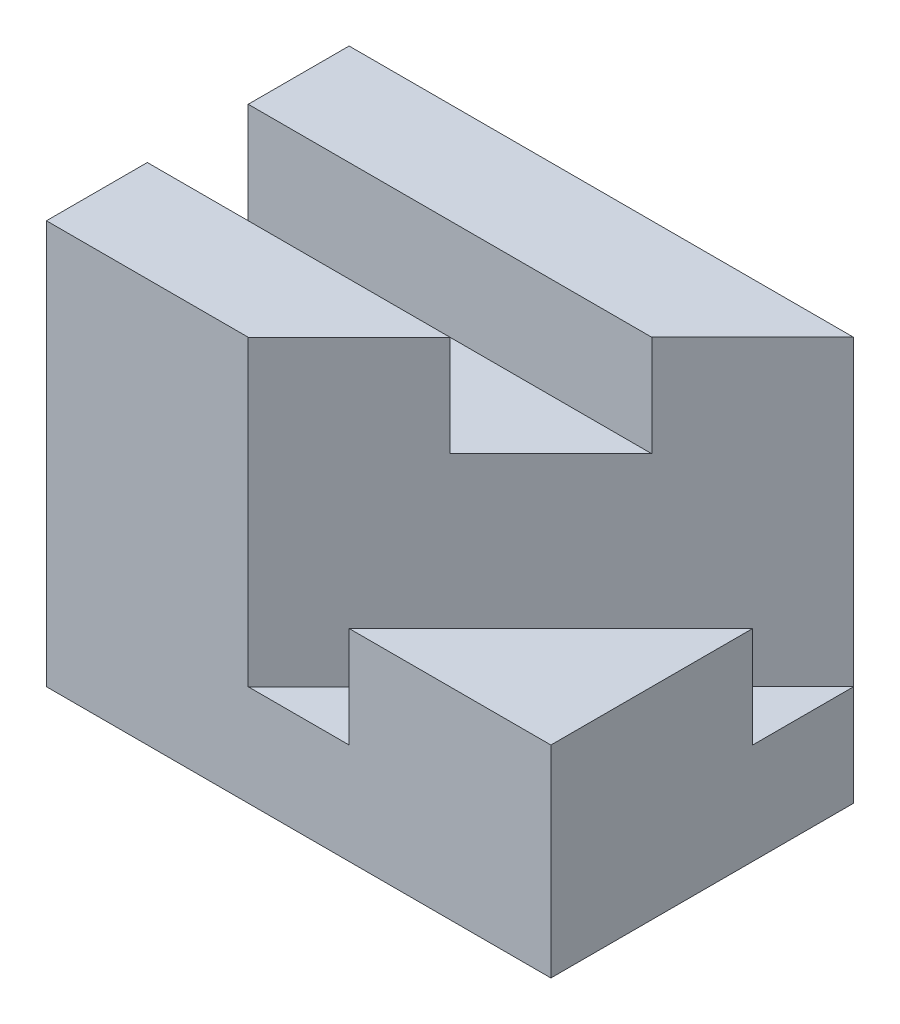
ISO-10303-21;
HEADER;
FILE_DESCRIPTION(('STEP AP214'),'2;1');
FILE_NAME('part.step','',(''),(''),'','','');
FILE_SCHEMA(('AUTOMOTIVE_DESIGN { 1 0 10303 214 1 1 1 1 }'));
ENDSEC;
DATA;
#1=APPLICATION_CONTEXT('core data for automotive mechanical design processes');
#2=APPLICATION_PROTOCOL_DEFINITION('international standard','automotive_design',2000,#1);
#3=PRODUCT_CONTEXT('',#1,'mechanical');
#4=PRODUCT('Part','Part','',(#3));
#5=PRODUCT_RELATED_PRODUCT_CATEGORY('part','',(#4));
#6=PRODUCT_DEFINITION_FORMATION('','',#4);
#7=PRODUCT_DEFINITION_CONTEXT('part definition',#1,'design');
#8=PRODUCT_DEFINITION('design','',#6,#7);
#9=PRODUCT_DEFINITION_SHAPE('','',#8);
#10=(LENGTH_UNIT() NAMED_UNIT(*) SI_UNIT(.MILLI.,.METRE.));
#11=(NAMED_UNIT(*) PLANE_ANGLE_UNIT() SI_UNIT($,.RADIAN.));
#12=(NAMED_UNIT(*) SI_UNIT($,.STERADIAN.) SOLID_ANGLE_UNIT());
#13=UNCERTAINTY_MEASURE_WITH_UNIT(LENGTH_MEASURE(1.E-05),#10,'distance_accuracy_value','');
#14=(GEOMETRIC_REPRESENTATION_CONTEXT(3) GLOBAL_UNCERTAINTY_ASSIGNED_CONTEXT((#13)) GLOBAL_UNIT_ASSIGNED_CONTEXT((#10,
#11,#12)) REPRESENTATION_CONTEXT('',''));
#15=CARTESIAN_POINT('',(0.,0.,0.));
#16=DIRECTION('',(0.,0.,1.));
#17=DIRECTION('',(1.,0.,0.));
#18=AXIS2_PLACEMENT_3D('',#15,#16,#17);
#19=CARTESIAN_POINT('',(0.,4.,0.));
#20=DIRECTION('',(0.,-1.,0.));
#21=DIRECTION('',(0.,0.,-1.));
#22=AXIS2_PLACEMENT_3D('',#19,#20,#21);
#23=PLANE('',#22);
#24=DIRECTION('',(0.707106781186547,0.,-0.707106781186548));
#25=VECTOR('',#24,1.);
#26=CARTESIAN_POINT('',(5.,4.,-3.));
#27=LINE('',#26,#25);
#28=CARTESIAN_POINT('',(2.,4.,0.));
#29=VERTEX_POINT('',#28);
#30=CARTESIAN_POINT('',(3.,4.,-1.));
#31=VERTEX_POINT('',#30);
#32=EDGE_CURVE('E200',#29,#31,#27,.T.);
#33=ORIENTED_EDGE('',*,*,#32,.T.);
#34=DIRECTION('',(-1.,0.,0.));
#35=VECTOR('',#34,1.);
#36=CARTESIAN_POINT('',(0.,4.,-1.));
#37=LINE('',#36,#35);
#38=CARTESIAN_POINT('',(0.,4.,-1.));
#39=VERTEX_POINT('',#38);
#40=EDGE_CURVE('E43',#31,#39,#37,.T.);
#41=ORIENTED_EDGE('',*,*,#40,.T.);
#42=DIRECTION('',(0.,0.,1.));
#43=VECTOR('',#42,1.);
#44=CARTESIAN_POINT('',(0.,4.,0.));
#45=LINE('',#44,#43);
#46=CARTESIAN_POINT('',(0.,4.,0.));
#47=VERTEX_POINT('',#46);
#48=EDGE_CURVE('E144',#39,#47,#45,.T.);
#49=ORIENTED_EDGE('',*,*,#48,.T.);
#50=DIRECTION('',(1.,0.,0.));
#51=VECTOR('',#50,1.);
#52=CARTESIAN_POINT('',(2.,4.,0.));
#53=LINE('',#52,#51);
#54=EDGE_CURVE('E152',#47,#29,#53,.T.);
#55=ORIENTED_EDGE('',*,*,#54,.T.);
#56=EDGE_LOOP('',(#33,#41,#49,#55));
#57=FACE_BOUND('',#56,.T.);
#58=ADVANCED_FACE('F35',(#57),#23,.F.);
#59=CARTESIAN_POINT('',(0.,1.,0.));
#60=DIRECTION('',(0.,1.,0.));
#61=DIRECTION('',(0.,0.,1.));
#62=AXIS2_PLACEMENT_3D('',#59,#60,#61);
#63=PLANE('',#62);
#64=DIRECTION('',(0.,0.,-1.));
#65=VECTOR('',#64,1.);
#66=CARTESIAN_POINT('',(5.,1.,0.));
#67=LINE('',#66,#65);
#68=CARTESIAN_POINT('',(5.,1.,-2.));
#69=VERTEX_POINT('',#68);
#70=CARTESIAN_POINT('',(5.,1.,-3.));
#71=VERTEX_POINT('',#70);
#72=EDGE_CURVE('E176',#69,#71,#67,.T.);
#73=ORIENTED_EDGE('',*,*,#72,.T.);
#74=DIRECTION('',(0.707106781186547,0.,-0.707106781186548));
#75=VECTOR('',#74,1.);
#76=CARTESIAN_POINT('',(5.,1.,-3.));
#77=LINE('',#76,#75);
#78=CARTESIAN_POINT('',(2.,1.,0.));
#79=VERTEX_POINT('',#78);
#80=EDGE_CURVE('E58',#79,#71,#77,.T.);
#81=ORIENTED_EDGE('',*,*,#80,.F.);
#82=DIRECTION('',(1.,0.,0.));
#83=VECTOR('',#82,1.);
#84=CARTESIAN_POINT('',(0.,1.,0.));
#85=LINE('',#84,#83);
#86=CARTESIAN_POINT('',(3.,1.,0.));
#87=VERTEX_POINT('',#86);
#88=EDGE_CURVE('E174',#79,#87,#85,.T.);
#89=ORIENTED_EDGE('',*,*,#88,.T.);
#90=DIRECTION('',(-0.707106781186547,0.,0.707106781186548));
#91=VECTOR('',#90,1.);
#92=CARTESIAN_POINT('',(3.,1.,0.));
#93=LINE('',#92,#91);
#94=EDGE_CURVE('E157',#69,#87,#93,.T.);
#95=ORIENTED_EDGE('',*,*,#94,.F.);
#96=EDGE_LOOP('',(#73,#81,#89,#95));
#97=FACE_BOUND('',#96,.T.);
#98=ADVANCED_FACE('F244',(#97),#63,.T.);
#99=CARTESIAN_POINT('',(0.,1.,-3.));
#100=DIRECTION('',(1.,0.,0.));
#101=DIRECTION('',(0.,0.,-1.));
#102=AXIS2_PLACEMENT_3D('',#99,#100,#101);
#103=PLANE('',#102);
#104=ORIENTED_EDGE('',*,*,#48,.F.);
#105=DIRECTION('',(0.,1.,0.));
#106=VECTOR('',#105,1.);
#107=CARTESIAN_POINT('',(0.,3.,-1.));
#108=LINE('',#107,#106);
#109=CARTESIAN_POINT('',(0.,3.,-1.));
#110=VERTEX_POINT('',#109);
#111=EDGE_CURVE('E203',#110,#39,#108,.T.);
#112=ORIENTED_EDGE('',*,*,#111,.F.);
#113=DIRECTION('',(0.,0.,1.));
#114=VECTOR('',#113,1.);
#115=CARTESIAN_POINT('',(0.,3.,-2.));
#116=LINE('',#115,#114);
#117=CARTESIAN_POINT('',(0.,3.,-2.));
#118=VERTEX_POINT('',#117);
#119=EDGE_CURVE('E137',#118,#110,#116,.T.);
#120=ORIENTED_EDGE('',*,*,#119,.F.);
#121=DIRECTION('',(0.,-1.,0.));
#122=VECTOR('',#121,1.);
#123=CARTESIAN_POINT('',(0.,4.,-2.));
#124=LINE('',#123,#122);
#125=CARTESIAN_POINT('',(0.,4.,-2.));
#126=VERTEX_POINT('',#125);
#127=EDGE_CURVE('E123',#126,#118,#124,.T.);
#128=ORIENTED_EDGE('',*,*,#127,.F.);
#129=CARTESIAN_POINT('',(0.,4.,-3.));
#130=VERTEX_POINT('',#129);
#131=EDGE_CURVE('E134',#130,#126,#45,.T.);
#132=ORIENTED_EDGE('',*,*,#131,.F.);
#133=DIRECTION('',(0.,-1.,0.));
#134=VECTOR('',#133,1.);
#135=CARTESIAN_POINT('',(0.,1.,-3.));
#136=LINE('',#135,#134);
#137=CARTESIAN_POINT('',(0.,0.,-3.));
#138=VERTEX_POINT('',#137);
#139=EDGE_CURVE('E179',#130,#138,#136,.T.);
#140=ORIENTED_EDGE('',*,*,#139,.T.);
#141=DIRECTION('',(0.,0.,1.));
#142=VECTOR('',#141,1.);
#143=CARTESIAN_POINT('',(0.,0.,-3.));
#144=LINE('',#143,#142);
#145=CARTESIAN_POINT('',(0.,0.,0.));
#146=VERTEX_POINT('',#145);
#147=EDGE_CURVE('E173',#138,#146,#144,.T.);
#148=ORIENTED_EDGE('',*,*,#147,.T.);
#149=DIRECTION('',(0.,-1.,0.));
#150=VECTOR('',#149,1.);
#151=CARTESIAN_POINT('',(0.,1.,0.));
#152=LINE('',#151,#150);
#153=EDGE_CURVE('E128',#47,#146,#152,.T.);
#154=ORIENTED_EDGE('',*,*,#153,.F.);
#155=EDGE_LOOP('',(#104,#112,#120,#128,#132,#140,#148,#154));
#156=FACE_BOUND('',#155,.T.);
#157=ADVANCED_FACE('F37',(#156),#103,.F.);
#158=CARTESIAN_POINT('',(0.,1.,0.));
#159=DIRECTION('',(0.,0.,-1.));
#160=DIRECTION('',(-1.,0.,0.));
#161=AXIS2_PLACEMENT_3D('',#158,#159,#160);
#162=PLANE('',#161);
#163=DIRECTION('',(1.,0.,0.));
#164=VECTOR('',#163,1.);
#165=CARTESIAN_POINT('',(0.,0.,0.));
#166=LINE('',#165,#164);
#167=CARTESIAN_POINT('',(5.,0.,0.));
#168=VERTEX_POINT('',#167);
#169=EDGE_CURVE('E182',#146,#168,#166,.T.);
#170=ORIENTED_EDGE('',*,*,#169,.T.);
#171=DIRECTION('',(0.,-1.,0.));
#172=VECTOR('',#171,1.);
#173=CARTESIAN_POINT('',(5.,1.,0.));
#174=LINE('',#173,#172);
#175=CARTESIAN_POINT('',(5.,2.,0.));
#176=VERTEX_POINT('',#175);
#177=EDGE_CURVE('E191',#176,#168,#174,.T.);
#178=ORIENTED_EDGE('',*,*,#177,.F.);
#179=DIRECTION('',(1.,0.,0.));
#180=VECTOR('',#179,1.);
#181=CARTESIAN_POINT('',(5.,2.,0.));
#182=LINE('',#181,#180);
#183=CARTESIAN_POINT('',(3.,2.,0.));
#184=VERTEX_POINT('',#183);
#185=EDGE_CURVE('E158',#184,#176,#182,.T.);
#186=ORIENTED_EDGE('',*,*,#185,.F.);
#187=DIRECTION('',(0.,-1.,0.));
#188=VECTOR('',#187,1.);
#189=CARTESIAN_POINT('',(3.,2.,0.));
#190=LINE('',#189,#188);
#191=EDGE_CURVE('E165',#184,#87,#190,.T.);
#192=ORIENTED_EDGE('',*,*,#191,.T.);
#193=ORIENTED_EDGE('',*,*,#88,.F.);
#194=DIRECTION('',(0.,-1.,0.));
#195=VECTOR('',#194,1.);
#196=CARTESIAN_POINT('',(2.,4.,0.));
#197=LINE('',#196,#195);
#198=EDGE_CURVE('E147',#29,#79,#197,.T.);
#199=ORIENTED_EDGE('',*,*,#198,.F.);
#200=ORIENTED_EDGE('',*,*,#54,.F.);
#201=ORIENTED_EDGE('',*,*,#153,.T.);
#202=EDGE_LOOP('',(#170,#178,#186,#192,#193,#199,#200,#201));
#203=FACE_BOUND('',#202,.T.);
#204=ADVANCED_FACE('F208',(#203),#162,.F.);
#205=CARTESIAN_POINT('',(5.,1.,0.));
#206=DIRECTION('',(-1.,0.,0.));
#207=DIRECTION('',(0.,0.,1.));
#208=AXIS2_PLACEMENT_3D('',#205,#206,#207);
#209=PLANE('',#208);
#210=DIRECTION('',(0.,0.,-1.));
#211=VECTOR('',#210,1.);
#212=CARTESIAN_POINT('',(5.,0.,0.));
#213=LINE('',#212,#211);
#214=CARTESIAN_POINT('',(5.,0.,-3.));
#215=VERTEX_POINT('',#214);
#216=EDGE_CURVE('E184',#168,#215,#213,.T.);
#217=ORIENTED_EDGE('',*,*,#216,.T.);
#218=DIRECTION('',(0.,-1.,0.));
#219=VECTOR('',#218,1.);
#220=CARTESIAN_POINT('',(5.,1.,-3.));
#221=LINE('',#220,#219);
#222=EDGE_CURVE('E188',#71,#215,#221,.T.);
#223=ORIENTED_EDGE('',*,*,#222,.F.);
#224=ORIENTED_EDGE('',*,*,#72,.F.);
#225=DIRECTION('',(0.,-1.,0.));
#226=VECTOR('',#225,1.);
#227=CARTESIAN_POINT('',(5.,2.,-2.));
#228=LINE('',#227,#226);
#229=CARTESIAN_POINT('',(5.,2.,-2.));
#230=VERTEX_POINT('',#229);
#231=EDGE_CURVE('E170',#230,#69,#228,.T.);
#232=ORIENTED_EDGE('',*,*,#231,.F.);
#233=DIRECTION('',(0.,0.,-1.));
#234=VECTOR('',#233,1.);
#235=CARTESIAN_POINT('',(5.,2.,0.));
#236=LINE('',#235,#234);
#237=EDGE_CURVE('E161',#176,#230,#236,.T.);
#238=ORIENTED_EDGE('',*,*,#237,.F.);
#239=ORIENTED_EDGE('',*,*,#177,.T.);
#240=EDGE_LOOP('',(#217,#223,#224,#232,#238,#239));
#241=FACE_BOUND('',#240,.T.);
#242=ADVANCED_FACE('F234',(#241),#209,.F.);
#243=CARTESIAN_POINT('',(5.,1.,-3.));
#244=DIRECTION('',(0.,0.,1.));
#245=DIRECTION('',(1.,0.,0.));
#246=AXIS2_PLACEMENT_3D('',#243,#244,#245);
#247=PLANE('',#246);
#248=DIRECTION('',(-1.,0.,0.));
#249=VECTOR('',#248,1.);
#250=CARTESIAN_POINT('',(5.,0.,-3.));
#251=LINE('',#250,#249);
#252=EDGE_CURVE('E177',#215,#138,#251,.T.);
#253=ORIENTED_EDGE('',*,*,#252,.T.);
#254=ORIENTED_EDGE('',*,*,#139,.F.);
#255=DIRECTION('',(-1.,0.,0.));
#256=VECTOR('',#255,1.);
#257=CARTESIAN_POINT('',(0.,4.,-3.));
#258=LINE('',#257,#256);
#259=CARTESIAN_POINT('',(5.,4.,-3.));
#260=VERTEX_POINT('',#259);
#261=EDGE_CURVE('E142',#260,#130,#258,.T.);
#262=ORIENTED_EDGE('',*,*,#261,.F.);
#263=DIRECTION('',(0.,-1.,0.));
#264=VECTOR('',#263,1.);
#265=CARTESIAN_POINT('',(5.,4.,-3.));
#266=LINE('',#265,#264);
#267=EDGE_CURVE('E143',#260,#71,#266,.T.);
#268=ORIENTED_EDGE('',*,*,#267,.T.);
#269=ORIENTED_EDGE('',*,*,#222,.T.);
#270=EDGE_LOOP('',(#253,#254,#262,#268,#269));
#271=FACE_BOUND('',#270,.T.);
#272=ADVANCED_FACE('F226',(#271),#247,.F.);
#273=CARTESIAN_POINT('',(0.,0.,0.));
#274=DIRECTION('',(0.,1.,0.));
#275=DIRECTION('',(0.,0.,1.));
#276=AXIS2_PLACEMENT_3D('',#273,#274,#275);
#277=PLANE('',#276);
#278=ORIENTED_EDGE('',*,*,#147,.F.);
#279=ORIENTED_EDGE('',*,*,#252,.F.);
#280=ORIENTED_EDGE('',*,*,#216,.F.);
#281=ORIENTED_EDGE('',*,*,#169,.F.);
#282=EDGE_LOOP('',(#278,#279,#280,#281));
#283=FACE_BOUND('',#282,.T.);
#284=ADVANCED_FACE('F229',(#283),#277,.F.);
#285=CARTESIAN_POINT('',(3.,2.,0.));
#286=DIRECTION('',(0.707106781186548,0.,0.707106781186547));
#287=DIRECTION('',(0.707106781186547,0.,-0.707106781186548));
#288=AXIS2_PLACEMENT_3D('',#285,#286,#287);
#289=PLANE('',#288);
#290=ORIENTED_EDGE('',*,*,#94,.T.);
#291=ORIENTED_EDGE('',*,*,#191,.F.);
#292=DIRECTION('',(-0.707106781186547,0.,0.707106781186548));
#293=VECTOR('',#292,1.);
#294=CARTESIAN_POINT('',(3.,2.,0.));
#295=LINE('',#294,#293);
#296=EDGE_CURVE('E163',#230,#184,#295,.T.);
#297=ORIENTED_EDGE('',*,*,#296,.F.);
#298=ORIENTED_EDGE('',*,*,#231,.T.);
#299=EDGE_LOOP('',(#290,#291,#297,#298));
#300=FACE_BOUND('',#299,.T.);
#301=ADVANCED_FACE('F243',(#300),#289,.F.);
#302=CARTESIAN_POINT('',(0.,2.,0.));
#303=DIRECTION('',(0.,-1.,0.));
#304=DIRECTION('',(0.,0.,-1.));
#305=AXIS2_PLACEMENT_3D('',#302,#303,#304);
#306=PLANE('',#305);
#307=ORIENTED_EDGE('',*,*,#185,.T.);
#308=ORIENTED_EDGE('',*,*,#237,.T.);
#309=ORIENTED_EDGE('',*,*,#296,.T.);
#310=EDGE_LOOP('',(#307,#308,#309));
#311=FACE_BOUND('',#310,.T.);
#312=ADVANCED_FACE('F240',(#311),#306,.F.);
#313=CARTESIAN_POINT('',(5.,4.,-3.));
#314=DIRECTION('',(-0.707106781186548,0.,-0.707106781186547));
#315=DIRECTION('',(-0.707106781186547,0.,0.707106781186548));
#316=AXIS2_PLACEMENT_3D('',#313,#314,#315);
#317=PLANE('',#316);
#318=DIRECTION('',(-0.707106781186547,0.,0.707106781186548));
#319=VECTOR('',#318,1.);
#320=CARTESIAN_POINT('',(5.,3.,-3.));
#321=LINE('',#320,#319);
#322=CARTESIAN_POINT('',(4.,3.,-2.));
#323=VERTEX_POINT('',#322);
#324=CARTESIAN_POINT('',(3.,3.,-1.));
#325=VERTEX_POINT('',#324);
#326=EDGE_CURVE('E11',#323,#325,#321,.T.);
#327=ORIENTED_EDGE('',*,*,#326,.T.);
#328=DIRECTION('',(0.,1.,0.));
#329=VECTOR('',#328,1.);
#330=CARTESIAN_POINT('',(3.,4.,-1.));
#331=LINE('',#330,#329);
#332=EDGE_CURVE('E153',#325,#31,#331,.T.);
#333=ORIENTED_EDGE('',*,*,#332,.T.);
#334=ORIENTED_EDGE('',*,*,#32,.F.);
#335=ORIENTED_EDGE('',*,*,#198,.T.);
#336=ORIENTED_EDGE('',*,*,#80,.T.);
#337=ORIENTED_EDGE('',*,*,#267,.F.);
#338=CARTESIAN_POINT('',(4.,4.,-2.));
#339=VERTEX_POINT('',#338);
#340=EDGE_CURVE('E209',#339,#260,#27,.T.);
#341=ORIENTED_EDGE('',*,*,#340,.F.);
#342=DIRECTION('',(0.,-1.,0.));
#343=VECTOR('',#342,1.);
#344=CARTESIAN_POINT('',(4.,4.,-2.));
#345=LINE('',#344,#343);
#346=EDGE_CURVE('E50',#339,#323,#345,.T.);
#347=ORIENTED_EDGE('',*,*,#346,.T.);
#348=EDGE_LOOP('',(#327,#333,#334,#335,#336,#337,#341,#347));
#349=FACE_BOUND('',#348,.T.);
#350=ADVANCED_FACE('F223',(#349),#317,.F.);
#351=ORIENTED_EDGE('',*,*,#131,.T.);
#352=DIRECTION('',(1.,0.,0.));
#353=VECTOR('',#352,1.);
#354=CARTESIAN_POINT('',(0.,4.,-2.));
#355=LINE('',#354,#353);
#356=EDGE_CURVE('E120',#126,#339,#355,.T.);
#357=ORIENTED_EDGE('',*,*,#356,.T.);
#358=ORIENTED_EDGE('',*,*,#340,.T.);
#359=ORIENTED_EDGE('',*,*,#261,.T.);
#360=EDGE_LOOP('',(#351,#357,#358,#359));
#361=FACE_BOUND('',#360,.T.);
#362=ADVANCED_FACE('F140',(#361),#23,.F.);
#363=CARTESIAN_POINT('',(6.,3.,-2.));
#364=DIRECTION('',(0.,-1.,0.));
#365=DIRECTION('',(0.,0.,-1.));
#366=AXIS2_PLACEMENT_3D('',#363,#364,#365);
#367=PLANE('',#366);
#368=DIRECTION('',(-1.,0.,0.));
#369=VECTOR('',#368,1.);
#370=CARTESIAN_POINT('',(6.,3.,-2.));
#371=LINE('',#370,#369);
#372=EDGE_CURVE('E215',#323,#118,#371,.T.);
#373=ORIENTED_EDGE('',*,*,#372,.T.);
#374=ORIENTED_EDGE('',*,*,#119,.T.);
#375=DIRECTION('',(-1.,0.,0.));
#376=VECTOR('',#375,1.);
#377=CARTESIAN_POINT('',(6.,3.,-1.));
#378=LINE('',#377,#376);
#379=EDGE_CURVE('E214',#325,#110,#378,.T.);
#380=ORIENTED_EDGE('',*,*,#379,.F.);
#381=ORIENTED_EDGE('',*,*,#326,.F.);
#382=EDGE_LOOP('',(#373,#374,#380,#381));
#383=FACE_BOUND('',#382,.T.);
#384=ADVANCED_FACE('F221',(#383),#367,.F.);
#385=CARTESIAN_POINT('',(6.,3.,-1.));
#386=DIRECTION('',(0.,0.,1.));
#387=DIRECTION('',(1.,0.,0.));
#388=AXIS2_PLACEMENT_3D('',#385,#386,#387);
#389=PLANE('',#388);
#390=ORIENTED_EDGE('',*,*,#379,.T.);
#391=ORIENTED_EDGE('',*,*,#111,.T.);
#392=ORIENTED_EDGE('',*,*,#40,.F.);
#393=ORIENTED_EDGE('',*,*,#332,.F.);
#394=EDGE_LOOP('',(#390,#391,#392,#393));
#395=FACE_BOUND('',#394,.T.);
#396=ADVANCED_FACE('F305',(#395),#389,.F.);
#397=CARTESIAN_POINT('',(6.,4.,-2.));
#398=DIRECTION('',(0.,0.,-1.));
#399=DIRECTION('',(-1.,0.,0.));
#400=AXIS2_PLACEMENT_3D('',#397,#398,#399);
#401=PLANE('',#400);
#402=ORIENTED_EDGE('',*,*,#356,.F.);
#403=ORIENTED_EDGE('',*,*,#127,.T.);
#404=ORIENTED_EDGE('',*,*,#372,.F.);
#405=ORIENTED_EDGE('',*,*,#346,.F.);
#406=EDGE_LOOP('',(#402,#403,#404,#405));
#407=FACE_BOUND('',#406,.T.);
#408=ADVANCED_FACE('F122',(#407),#401,.F.);
#409=CLOSED_SHELL('',(#58,#98,#157,#204,#242,#272,#284,#301,#312,#350,#362,#384,#396,#408));
#410=MANIFOLD_SOLID_BREP('B2',#409);
#411=ADVANCED_BREP_SHAPE_REPRESENTATION('',(#18,#410),#14);
#412=SHAPE_DEFINITION_REPRESENTATION(#9,#411);
ENDSEC;
END-ISO-10303-21;
